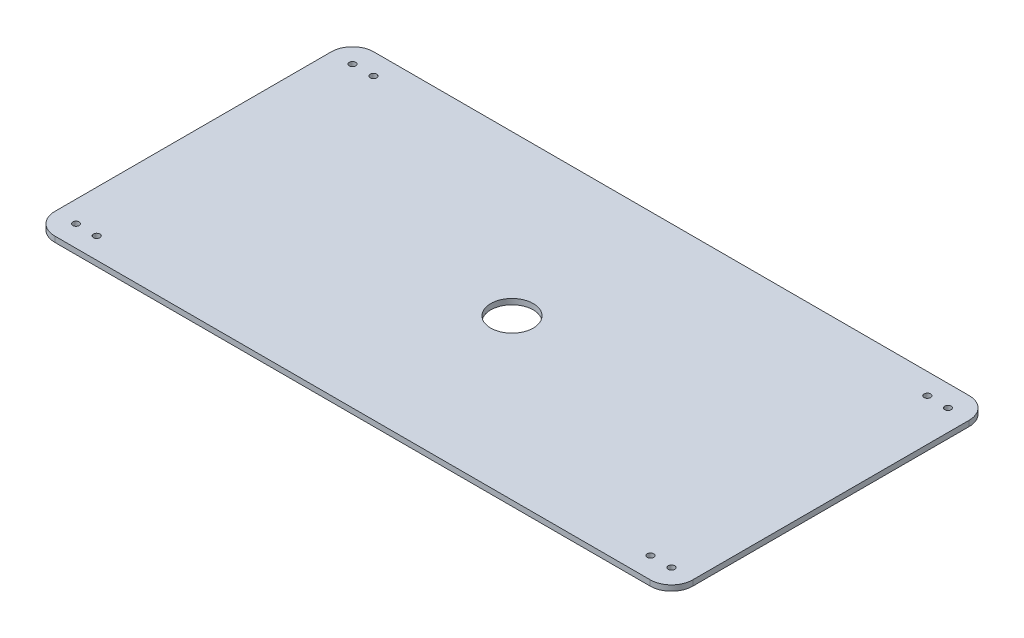
ISO-10303-21;
HEADER;
FILE_DESCRIPTION(('STEP AP214'),'2;1');
FILE_NAME('part.step','',(''),(''),'','','');
FILE_SCHEMA(('AUTOMOTIVE_DESIGN { 1 0 10303 214 1 1 1 1 }'));
ENDSEC;
DATA;
#1=APPLICATION_CONTEXT('core data for automotive mechanical design processes');
#2=APPLICATION_PROTOCOL_DEFINITION('international standard','automotive_design',2000,#1);
#3=PRODUCT_CONTEXT('',#1,'mechanical');
#4=PRODUCT('Part','Part','',(#3));
#5=PRODUCT_RELATED_PRODUCT_CATEGORY('part','',(#4));
#6=PRODUCT_DEFINITION_FORMATION('','',#4);
#7=PRODUCT_DEFINITION_CONTEXT('part definition',#1,'design');
#8=PRODUCT_DEFINITION('design','',#6,#7);
#9=PRODUCT_DEFINITION_SHAPE('','',#8);
#10=(LENGTH_UNIT() NAMED_UNIT(*) SI_UNIT(.MILLI.,.METRE.));
#11=(NAMED_UNIT(*) PLANE_ANGLE_UNIT() SI_UNIT($,.RADIAN.));
#12=(NAMED_UNIT(*) SI_UNIT($,.STERADIAN.) SOLID_ANGLE_UNIT());
#13=UNCERTAINTY_MEASURE_WITH_UNIT(LENGTH_MEASURE(1.E-05),#10,'distance_accuracy_value','');
#14=(GEOMETRIC_REPRESENTATION_CONTEXT(3) GLOBAL_UNCERTAINTY_ASSIGNED_CONTEXT((#13)) GLOBAL_UNIT_ASSIGNED_CONTEXT((#10,
#11,#12)) REPRESENTATION_CONTEXT('',''));
#15=CARTESIAN_POINT('',(0.,0.,0.));
#16=DIRECTION('',(0.,0.,1.));
#17=DIRECTION('',(1.,0.,0.));
#18=AXIS2_PLACEMENT_3D('',#15,#16,#17);
#19=CARTESIAN_POINT('',(0.,2.6,0.));
#20=DIRECTION('',(1.,0.,0.));
#21=DIRECTION('',(0.,0.,-1.));
#22=AXIS2_PLACEMENT_3D('',#19,#20,#21);
#23=PLANE('',#22);
#24=DIRECTION('',(0.,0.,1.));
#25=VECTOR('',#24,1.);
#26=CARTESIAN_POINT('',(0.,2.6,0.));
#27=LINE('',#26,#25);
#28=CARTESIAN_POINT('',(0.,2.6,10.));
#29=VERTEX_POINT('',#28);
#30=CARTESIAN_POINT('',(0.,2.6,140.));
#31=VERTEX_POINT('',#30);
#32=EDGE_CURVE('E120',#29,#31,#27,.T.);
#33=ORIENTED_EDGE('',*,*,#32,.F.);
#34=DIRECTION('',(0.,-1.,0.));
#35=VECTOR('',#34,1.);
#36=CARTESIAN_POINT('',(0.,0.,10.));
#37=LINE('',#36,#35);
#38=CARTESIAN_POINT('',(0.,0.,10.));
#39=VERTEX_POINT('',#38);
#40=EDGE_CURVE('E105',#29,#39,#37,.T.);
#41=ORIENTED_EDGE('',*,*,#40,.T.);
#42=DIRECTION('',(0.,0.,1.));
#43=VECTOR('',#42,1.);
#44=CARTESIAN_POINT('',(0.,0.,0.));
#45=LINE('',#44,#43);
#46=CARTESIAN_POINT('',(0.,0.,140.));
#47=VERTEX_POINT('',#46);
#48=EDGE_CURVE('E117',#39,#47,#45,.T.);
#49=ORIENTED_EDGE('',*,*,#48,.T.);
#50=DIRECTION('',(0.,-1.,0.));
#51=VECTOR('',#50,1.);
#52=CARTESIAN_POINT('',(0.,2.6,140.));
#53=LINE('',#52,#51);
#54=EDGE_CURVE('E122',#47,#31,#53,.F.);
#55=ORIENTED_EDGE('',*,*,#54,.T.);
#56=EDGE_LOOP('',(#33,#41,#49,#55));
#57=FACE_BOUND('',#56,.T.);
#58=ADVANCED_FACE('F35',(#57),#23,.F.);
#59=CARTESIAN_POINT('',(0.,2.6,150.));
#60=DIRECTION('',(0.,0.,-1.));
#61=DIRECTION('',(-1.,0.,0.));
#62=AXIS2_PLACEMENT_3D('',#59,#60,#61);
#63=PLANE('',#62);
#64=DIRECTION('',(1.,0.,0.));
#65=VECTOR('',#64,1.);
#66=CARTESIAN_POINT('',(0.,2.6,150.));
#67=LINE('',#66,#65);
#68=CARTESIAN_POINT('',(10.,2.6,150.));
#69=VERTEX_POINT('',#68);
#70=CARTESIAN_POINT('',(290.,2.6,150.));
#71=VERTEX_POINT('',#70);
#72=EDGE_CURVE('E167',#69,#71,#67,.T.);
#73=ORIENTED_EDGE('',*,*,#72,.F.);
#74=DIRECTION('',(0.,-1.,0.));
#75=VECTOR('',#74,1.);
#76=CARTESIAN_POINT('',(10.,2.6,150.));
#77=LINE('',#76,#75);
#78=CARTESIAN_POINT('',(10.,0.,150.));
#79=VERTEX_POINT('',#78);
#80=EDGE_CURVE('E160',#69,#79,#77,.T.);
#81=ORIENTED_EDGE('',*,*,#80,.T.);
#82=DIRECTION('',(1.,0.,0.));
#83=VECTOR('',#82,1.);
#84=CARTESIAN_POINT('',(0.,0.,150.));
#85=LINE('',#84,#83);
#86=CARTESIAN_POINT('',(290.,0.,150.));
#87=VERTEX_POINT('',#86);
#88=EDGE_CURVE('E126',#79,#87,#85,.T.);
#89=ORIENTED_EDGE('',*,*,#88,.T.);
#90=DIRECTION('',(0.,-1.,0.));
#91=VECTOR('',#90,1.);
#92=CARTESIAN_POINT('',(290.,2.6,150.));
#93=LINE('',#92,#91);
#94=EDGE_CURVE('E158',#87,#71,#93,.F.);
#95=ORIENTED_EDGE('',*,*,#94,.T.);
#96=EDGE_LOOP('',(#73,#81,#89,#95));
#97=FACE_BOUND('',#96,.T.);
#98=ADVANCED_FACE('F165',(#97),#63,.F.);
#99=CARTESIAN_POINT('',(300.,2.6,0.));
#100=DIRECTION('',(1.,0.,0.));
#101=DIRECTION('',(0.,0.,-1.));
#102=AXIS2_PLACEMENT_3D('',#99,#100,#101);
#103=PLANE('',#102);
#104=DIRECTION('',(0.,0.,1.));
#105=VECTOR('',#104,1.);
#106=CARTESIAN_POINT('',(300.,2.6,0.));
#107=LINE('',#106,#105);
#108=CARTESIAN_POINT('',(300.,2.6,10.));
#109=VERTEX_POINT('',#108);
#110=CARTESIAN_POINT('',(300.,2.6,140.));
#111=VERTEX_POINT('',#110);
#112=EDGE_CURVE('E174',#109,#111,#107,.T.);
#113=ORIENTED_EDGE('',*,*,#112,.T.);
#114=DIRECTION('',(0.,-1.,0.));
#115=VECTOR('',#114,1.);
#116=CARTESIAN_POINT('',(300.,0.,140.));
#117=LINE('',#116,#115);
#118=CARTESIAN_POINT('',(300.,0.,140.));
#119=VERTEX_POINT('',#118);
#120=EDGE_CURVE('E11',#111,#119,#117,.T.);
#121=ORIENTED_EDGE('',*,*,#120,.T.);
#122=DIRECTION('',(0.,0.,1.));
#123=VECTOR('',#122,1.);
#124=CARTESIAN_POINT('',(300.,0.,0.));
#125=LINE('',#124,#123);
#126=CARTESIAN_POINT('',(300.,0.,10.));
#127=VERTEX_POINT('',#126);
#128=EDGE_CURVE('E130',#127,#119,#125,.T.);
#129=ORIENTED_EDGE('',*,*,#128,.F.);
#130=DIRECTION('',(0.,-1.,0.));
#131=VECTOR('',#130,1.);
#132=CARTESIAN_POINT('',(300.,2.6,10.));
#133=LINE('',#132,#131);
#134=EDGE_CURVE('E43',#127,#109,#133,.F.);
#135=ORIENTED_EDGE('',*,*,#134,.T.);
#136=EDGE_LOOP('',(#113,#121,#129,#135));
#137=FACE_BOUND('',#136,.T.);
#138=ADVANCED_FACE('F173',(#137),#103,.T.);
#139=CARTESIAN_POINT('',(0.,2.6,0.));
#140=DIRECTION('',(0.,0.,-1.));
#141=DIRECTION('',(-1.,0.,0.));
#142=AXIS2_PLACEMENT_3D('',#139,#140,#141);
#143=PLANE('',#142);
#144=DIRECTION('',(1.,0.,0.));
#145=VECTOR('',#144,1.);
#146=CARTESIAN_POINT('',(0.,0.,0.));
#147=LINE('',#146,#145);
#148=CARTESIAN_POINT('',(10.,0.,0.));
#149=VERTEX_POINT('',#148);
#150=CARTESIAN_POINT('',(290.,0.,0.));
#151=VERTEX_POINT('',#150);
#152=EDGE_CURVE('E141',#149,#151,#147,.T.);
#153=ORIENTED_EDGE('',*,*,#152,.F.);
#154=DIRECTION('',(0.,-1.,0.));
#155=VECTOR('',#154,1.);
#156=CARTESIAN_POINT('',(10.,2.6,0.));
#157=LINE('',#156,#155);
#158=CARTESIAN_POINT('',(10.,2.6,0.));
#159=VERTEX_POINT('',#158);
#160=EDGE_CURVE('E106',#149,#159,#157,.F.);
#161=ORIENTED_EDGE('',*,*,#160,.T.);
#162=DIRECTION('',(1.,0.,0.));
#163=VECTOR('',#162,1.);
#164=CARTESIAN_POINT('',(0.,2.6,0.));
#165=LINE('',#164,#163);
#166=CARTESIAN_POINT('',(290.,2.6,0.));
#167=VERTEX_POINT('',#166);
#168=EDGE_CURVE('E136',#159,#167,#165,.T.);
#169=ORIENTED_EDGE('',*,*,#168,.T.);
#170=DIRECTION('',(0.,-1.,0.));
#171=VECTOR('',#170,1.);
#172=CARTESIAN_POINT('',(290.,2.6,0.));
#173=LINE('',#172,#171);
#174=EDGE_CURVE('E111',#167,#151,#173,.T.);
#175=ORIENTED_EDGE('',*,*,#174,.T.);
#176=EDGE_LOOP('',(#153,#161,#169,#175));
#177=FACE_BOUND('',#176,.T.);
#178=ADVANCED_FACE('F361',(#177),#143,.T.);
#179=CARTESIAN_POINT('',(0.,2.6,0.));
#180=DIRECTION('',(0.,1.,0.));
#181=DIRECTION('',(0.,0.,1.));
#182=AXIS2_PLACEMENT_3D('',#179,#180,#181);
#183=PLANE('',#182);
#184=CARTESIAN_POINT('',(19.812,2.6,140.094));
#185=DIRECTION('',(0.,-1.,0.));
#186=DIRECTION('',(0.,0.,-1.));
#187=AXIS2_PLACEMENT_3D('',#184,#185,#186);
#188=CIRCLE('',#187,1.524);
#189=CARTESIAN_POINT('',(19.812,2.6,138.57));
#190=VERTEX_POINT('',#189);
#191=EDGE_CURVE('E225',#190,#190,#188,.T.);
#192=ORIENTED_EDGE('',*,*,#191,.T.);
#193=EDGE_LOOP('',(#192));
#194=FACE_BOUND('',#193,.T.);
#195=CARTESIAN_POINT('',(280.188,2.6,140.094));
#196=DIRECTION('',(0.,1.,0.));
#197=DIRECTION('',(0.,0.,-1.));
#198=AXIS2_PLACEMENT_3D('',#195,#196,#197);
#199=CIRCLE('',#198,1.524);
#200=CARTESIAN_POINT('',(280.188,2.6,138.57));
#201=VERTEX_POINT('',#200);
#202=EDGE_CURVE('E219',#201,#201,#199,.T.);
#203=ORIENTED_EDGE('',*,*,#202,.F.);
#204=EDGE_LOOP('',(#203));
#205=FACE_BOUND('',#204,.T.);
#206=CARTESIAN_POINT('',(280.188,2.6,9.90599999999998));
#207=DIRECTION('',(0.,-1.,0.));
#208=DIRECTION('',(0.,0.,1.));
#209=AXIS2_PLACEMENT_3D('',#206,#207,#208);
#210=CIRCLE('',#209,1.524);
#211=CARTESIAN_POINT('',(280.188,2.6,11.43));
#212=VERTEX_POINT('',#211);
#213=EDGE_CURVE('E213',#212,#212,#210,.T.);
#214=ORIENTED_EDGE('',*,*,#213,.T.);
#215=EDGE_LOOP('',(#214));
#216=FACE_BOUND('',#215,.T.);
#217=CARTESIAN_POINT('',(19.812,2.6,9.906));
#218=DIRECTION('',(0.,1.,0.));
#219=DIRECTION('',(0.,0.,1.));
#220=AXIS2_PLACEMENT_3D('',#217,#218,#219);
#221=CIRCLE('',#220,1.524);
#222=CARTESIAN_POINT('',(19.812,2.6,11.43));
#223=VERTEX_POINT('',#222);
#224=EDGE_CURVE('E207',#223,#223,#221,.T.);
#225=ORIENTED_EDGE('',*,*,#224,.F.);
#226=EDGE_LOOP('',(#225));
#227=FACE_BOUND('',#226,.T.);
#228=CARTESIAN_POINT('',(150.,2.6,75.));
#229=DIRECTION('',(0.,-1.,0.));
#230=DIRECTION('',(0.,0.,-1.));
#231=AXIS2_PLACEMENT_3D('',#228,#229,#230);
#232=CIRCLE('',#231,9.99999999999998);
#233=CARTESIAN_POINT('',(150.,2.6,65.));
#234=VERTEX_POINT('',#233);
#235=EDGE_CURVE('E198',#234,#234,#232,.T.);
#236=ORIENTED_EDGE('',*,*,#235,.T.);
#237=EDGE_LOOP('',(#236));
#238=FACE_BOUND('',#237,.T.);
#239=CARTESIAN_POINT('',(290.,2.6,140.));
#240=DIRECTION('',(0.,1.,0.));
#241=DIRECTION('',(0.,0.,1.));
#242=AXIS2_PLACEMENT_3D('',#239,#240,#241);
#243=CIRCLE('',#242,1.50000000000002);
#244=CARTESIAN_POINT('',(290.,2.6,141.5));
#245=VERTEX_POINT('',#244);
#246=EDGE_CURVE('E192',#245,#245,#243,.T.);
#247=ORIENTED_EDGE('',*,*,#246,.F.);
#248=EDGE_LOOP('',(#247));
#249=FACE_BOUND('',#248,.T.);
#250=CARTESIAN_POINT('',(10.,2.6,140.));
#251=DIRECTION('',(0.,-1.,0.));
#252=DIRECTION('',(0.,0.,1.));
#253=AXIS2_PLACEMENT_3D('',#250,#251,#252);
#254=CIRCLE('',#253,1.50000000000002);
#255=CARTESIAN_POINT('',(10.,2.6,141.5));
#256=VERTEX_POINT('',#255);
#257=EDGE_CURVE('E186',#256,#256,#254,.T.);
#258=ORIENTED_EDGE('',*,*,#257,.T.);
#259=EDGE_LOOP('',(#258));
#260=FACE_BOUND('',#259,.T.);
#261=CARTESIAN_POINT('',(10.,2.6,10.));
#262=DIRECTION('',(0.,1.,0.));
#263=DIRECTION('',(0.,0.,-1.));
#264=AXIS2_PLACEMENT_3D('',#261,#262,#263);
#265=CIRCLE('',#264,1.50000000000002);
#266=CARTESIAN_POINT('',(10.,2.6,8.49999999999999));
#267=VERTEX_POINT('',#266);
#268=EDGE_CURVE('E181',#267,#267,#265,.T.);
#269=ORIENTED_EDGE('',*,*,#268,.F.);
#270=EDGE_LOOP('',(#269));
#271=FACE_BOUND('',#270,.T.);
#272=CARTESIAN_POINT('',(290.,2.6,10.));
#273=DIRECTION('',(0.,-1.,0.));
#274=DIRECTION('',(0.,0.,-1.));
#275=AXIS2_PLACEMENT_3D('',#272,#273,#274);
#276=CIRCLE('',#275,1.50000000000002);
#277=CARTESIAN_POINT('',(290.,2.6,8.49999999999998));
#278=VERTEX_POINT('',#277);
#279=EDGE_CURVE('E127',#278,#278,#276,.T.);
#280=ORIENTED_EDGE('',*,*,#279,.T.);
#281=EDGE_LOOP('',(#280));
#282=FACE_BOUND('',#281,.T.);
#283=ORIENTED_EDGE('',*,*,#168,.F.);
#284=CARTESIAN_POINT('',(10.,2.6,10.));
#285=DIRECTION('',(0.,1.,0.));
#286=DIRECTION('',(0.,0.,1.));
#287=AXIS2_PLACEMENT_3D('',#284,#285,#286);
#288=CIRCLE('',#287,10.);
#289=EDGE_CURVE('E156',#159,#29,#288,.T.);
#290=ORIENTED_EDGE('',*,*,#289,.T.);
#291=ORIENTED_EDGE('',*,*,#32,.T.);
#292=CARTESIAN_POINT('',(10.,2.6,140.));
#293=DIRECTION('',(0.,1.,0.));
#294=DIRECTION('',(0.,0.,1.));
#295=AXIS2_PLACEMENT_3D('',#292,#293,#294);
#296=CIRCLE('',#295,10.);
#297=EDGE_CURVE('E154',#31,#69,#296,.T.);
#298=ORIENTED_EDGE('',*,*,#297,.T.);
#299=ORIENTED_EDGE('',*,*,#72,.T.);
#300=CARTESIAN_POINT('',(290.,2.6,140.));
#301=DIRECTION('',(0.,1.,0.));
#302=DIRECTION('',(0.,0.,1.));
#303=AXIS2_PLACEMENT_3D('',#300,#301,#302);
#304=CIRCLE('',#303,10.);
#305=EDGE_CURVE('E50',#71,#111,#304,.T.);
#306=ORIENTED_EDGE('',*,*,#305,.T.);
#307=ORIENTED_EDGE('',*,*,#112,.F.);
#308=CARTESIAN_POINT('',(290.,2.6,10.));
#309=DIRECTION('',(0.,1.,0.));
#310=DIRECTION('',(0.,0.,1.));
#311=AXIS2_PLACEMENT_3D('',#308,#309,#310);
#312=CIRCLE('',#311,10.);
#313=EDGE_CURVE('E151',#109,#167,#312,.T.);
#314=ORIENTED_EDGE('',*,*,#313,.T.);
#315=EDGE_LOOP('',(#283,#290,#291,#298,#299,#306,#307,#314));
#316=FACE_BOUND('',#315,.T.);
#317=ADVANCED_FACE('F236',(#194,#205,#216,#227,#238,#249,#260,#271,#282,#316),#183,.T.);
#318=CARTESIAN_POINT('',(0.,0.,0.));
#319=DIRECTION('',(0.,1.,0.));
#320=DIRECTION('',(0.,0.,1.));
#321=AXIS2_PLACEMENT_3D('',#318,#319,#320);
#322=PLANE('',#321);
#323=CARTESIAN_POINT('',(19.812,1.19999999954185E-07,140.094));
#324=DIRECTION('',(0.,-1.,0.));
#325=DIRECTION('',(0.,0.,-1.));
#326=AXIS2_PLACEMENT_3D('',#323,#324,#325);
#327=CIRCLE('',#326,1.524);
#328=CARTESIAN_POINT('',(19.812,1.19999999954185E-07,138.57));
#329=VERTEX_POINT('',#328);
#330=EDGE_CURVE('E222',#329,#329,#327,.T.);
#331=ORIENTED_EDGE('',*,*,#330,.F.);
#332=EDGE_LOOP('',(#331));
#333=FACE_BOUND('',#332,.T.);
#334=CARTESIAN_POINT('',(280.188,1.19999999954185E-07,140.094));
#335=DIRECTION('',(0.,1.,0.));
#336=DIRECTION('',(0.,0.,-1.));
#337=AXIS2_PLACEMENT_3D('',#334,#335,#336);
#338=CIRCLE('',#337,1.524);
#339=CARTESIAN_POINT('',(280.188,1.19999999954185E-07,138.57));
#340=VERTEX_POINT('',#339);
#341=EDGE_CURVE('E216',#340,#340,#338,.T.);
#342=ORIENTED_EDGE('',*,*,#341,.T.);
#343=EDGE_LOOP('',(#342));
#344=FACE_BOUND('',#343,.T.);
#345=CARTESIAN_POINT('',(280.188,1.19999999954185E-07,9.90599999999998));
#346=DIRECTION('',(0.,-1.,0.));
#347=DIRECTION('',(0.,0.,1.));
#348=AXIS2_PLACEMENT_3D('',#345,#346,#347);
#349=CIRCLE('',#348,1.524);
#350=CARTESIAN_POINT('',(280.188,1.19999999954185E-07,11.43));
#351=VERTEX_POINT('',#350);
#352=EDGE_CURVE('E210',#351,#351,#349,.T.);
#353=ORIENTED_EDGE('',*,*,#352,.F.);
#354=EDGE_LOOP('',(#353));
#355=FACE_BOUND('',#354,.T.);
#356=CARTESIAN_POINT('',(19.812,1.19999999954185E-07,9.906));
#357=DIRECTION('',(0.,1.,0.));
#358=DIRECTION('',(0.,0.,1.));
#359=AXIS2_PLACEMENT_3D('',#356,#357,#358);
#360=CIRCLE('',#359,1.524);
#361=CARTESIAN_POINT('',(19.812,1.19999999954185E-07,11.43));
#362=VERTEX_POINT('',#361);
#363=EDGE_CURVE('E204',#362,#362,#360,.T.);
#364=ORIENTED_EDGE('',*,*,#363,.T.);
#365=EDGE_LOOP('',(#364));
#366=FACE_BOUND('',#365,.T.);
#367=CARTESIAN_POINT('',(150.,0.,75.));
#368=DIRECTION('',(0.,-1.,0.));
#369=DIRECTION('',(0.,0.,-1.));
#370=AXIS2_PLACEMENT_3D('',#367,#368,#369);
#371=CIRCLE('',#370,9.99999999999998);
#372=CARTESIAN_POINT('',(150.,0.,65.));
#373=VERTEX_POINT('',#372);
#374=EDGE_CURVE('E201',#373,#373,#371,.T.);
#375=ORIENTED_EDGE('',*,*,#374,.F.);
#376=EDGE_LOOP('',(#375));
#377=FACE_BOUND('',#376,.T.);
#378=CARTESIAN_POINT('',(290.,0.,140.));
#379=DIRECTION('',(0.,1.,0.));
#380=DIRECTION('',(0.,0.,1.));
#381=AXIS2_PLACEMENT_3D('',#378,#379,#380);
#382=CIRCLE('',#381,1.50000000000002);
#383=CARTESIAN_POINT('',(290.,0.,141.5));
#384=VERTEX_POINT('',#383);
#385=EDGE_CURVE('E195',#384,#384,#382,.T.);
#386=ORIENTED_EDGE('',*,*,#385,.T.);
#387=EDGE_LOOP('',(#386));
#388=FACE_BOUND('',#387,.T.);
#389=CARTESIAN_POINT('',(10.,0.,140.));
#390=DIRECTION('',(0.,-1.,0.));
#391=DIRECTION('',(0.,0.,1.));
#392=AXIS2_PLACEMENT_3D('',#389,#390,#391);
#393=CIRCLE('',#392,1.50000000000002);
#394=CARTESIAN_POINT('',(10.,0.,141.5));
#395=VERTEX_POINT('',#394);
#396=EDGE_CURVE('E189',#395,#395,#393,.T.);
#397=ORIENTED_EDGE('',*,*,#396,.F.);
#398=EDGE_LOOP('',(#397));
#399=FACE_BOUND('',#398,.T.);
#400=CARTESIAN_POINT('',(10.,0.,10.));
#401=DIRECTION('',(0.,1.,0.));
#402=DIRECTION('',(0.,0.,-1.));
#403=AXIS2_PLACEMENT_3D('',#400,#401,#402);
#404=CIRCLE('',#403,1.50000000000002);
#405=CARTESIAN_POINT('',(10.,0.,8.49999999999999));
#406=VERTEX_POINT('',#405);
#407=EDGE_CURVE('E183',#406,#406,#404,.T.);
#408=ORIENTED_EDGE('',*,*,#407,.T.);
#409=EDGE_LOOP('',(#408));
#410=FACE_BOUND('',#409,.T.);
#411=CARTESIAN_POINT('',(290.,0.,10.));
#412=DIRECTION('',(0.,-1.,0.));
#413=DIRECTION('',(0.,0.,-1.));
#414=AXIS2_PLACEMENT_3D('',#411,#412,#413);
#415=CIRCLE('',#414,1.50000000000002);
#416=CARTESIAN_POINT('',(290.,0.,8.49999999999998));
#417=VERTEX_POINT('',#416);
#418=EDGE_CURVE('E133',#417,#417,#415,.T.);
#419=ORIENTED_EDGE('',*,*,#418,.F.);
#420=EDGE_LOOP('',(#419));
#421=FACE_BOUND('',#420,.T.);
#422=ORIENTED_EDGE('',*,*,#48,.F.);
#423=CARTESIAN_POINT('',(10.,0.,10.));
#424=DIRECTION('',(0.,1.,0.));
#425=DIRECTION('',(0.,0.,1.));
#426=AXIS2_PLACEMENT_3D('',#423,#424,#425);
#427=CIRCLE('',#426,10.);
#428=EDGE_CURVE('E101',#39,#149,#427,.F.);
#429=ORIENTED_EDGE('',*,*,#428,.T.);
#430=ORIENTED_EDGE('',*,*,#152,.T.);
#431=CARTESIAN_POINT('',(290.,0.,10.));
#432=DIRECTION('',(0.,1.,0.));
#433=DIRECTION('',(0.,0.,1.));
#434=AXIS2_PLACEMENT_3D('',#431,#432,#433);
#435=CIRCLE('',#434,10.);
#436=EDGE_CURVE('E121',#151,#127,#435,.F.);
#437=ORIENTED_EDGE('',*,*,#436,.T.);
#438=ORIENTED_EDGE('',*,*,#128,.T.);
#439=CARTESIAN_POINT('',(290.,0.,140.));
#440=DIRECTION('',(0.,1.,0.));
#441=DIRECTION('',(0.,0.,1.));
#442=AXIS2_PLACEMENT_3D('',#439,#440,#441);
#443=CIRCLE('',#442,10.);
#444=EDGE_CURVE('E145',#119,#87,#443,.F.);
#445=ORIENTED_EDGE('',*,*,#444,.T.);
#446=ORIENTED_EDGE('',*,*,#88,.F.);
#447=CARTESIAN_POINT('',(10.,0.,140.));
#448=DIRECTION('',(0.,1.,0.));
#449=DIRECTION('',(0.,0.,1.));
#450=AXIS2_PLACEMENT_3D('',#447,#448,#449);
#451=CIRCLE('',#450,10.);
#452=EDGE_CURVE('E112',#79,#47,#451,.F.);
#453=ORIENTED_EDGE('',*,*,#452,.T.);
#454=EDGE_LOOP('',(#422,#429,#430,#437,#438,#445,#446,#453));
#455=FACE_BOUND('',#454,.T.);
#456=ADVANCED_FACE('F124',(#333,#344,#355,#366,#377,#388,#399,#410,#421,#455),#322,.F.);
#457=CARTESIAN_POINT('',(10.,2.6,10.));
#458=DIRECTION('',(0.,1.,0.));
#459=DIRECTION('',(0.,0.,1.));
#460=AXIS2_PLACEMENT_3D('',#457,#458,#459);
#461=CYLINDRICAL_SURFACE('',#460,10.);
#462=ORIENTED_EDGE('',*,*,#289,.F.);
#463=ORIENTED_EDGE('',*,*,#160,.F.);
#464=ORIENTED_EDGE('',*,*,#428,.F.);
#465=ORIENTED_EDGE('',*,*,#40,.F.);
#466=EDGE_LOOP('',(#462,#463,#464,#465));
#467=FACE_BOUND('',#466,.T.);
#468=ADVANCED_FACE('F104',(#467),#461,.T.);
#469=CARTESIAN_POINT('',(10.,2.6,140.));
#470=DIRECTION('',(0.,-1.,0.));
#471=DIRECTION('',(0.,0.,-1.));
#472=AXIS2_PLACEMENT_3D('',#469,#470,#471);
#473=CYLINDRICAL_SURFACE('',#472,10.);
#474=ORIENTED_EDGE('',*,*,#297,.F.);
#475=ORIENTED_EDGE('',*,*,#54,.F.);
#476=ORIENTED_EDGE('',*,*,#452,.F.);
#477=ORIENTED_EDGE('',*,*,#80,.F.);
#478=EDGE_LOOP('',(#474,#475,#476,#477));
#479=FACE_BOUND('',#478,.T.);
#480=ADVANCED_FACE('F279',(#479),#473,.T.);
#481=CARTESIAN_POINT('',(290.,2.6,140.));
#482=DIRECTION('',(0.,1.,0.));
#483=DIRECTION('',(0.,0.,1.));
#484=AXIS2_PLACEMENT_3D('',#481,#482,#483);
#485=CYLINDRICAL_SURFACE('',#484,10.);
#486=ORIENTED_EDGE('',*,*,#305,.F.);
#487=ORIENTED_EDGE('',*,*,#94,.F.);
#488=ORIENTED_EDGE('',*,*,#444,.F.);
#489=ORIENTED_EDGE('',*,*,#120,.F.);
#490=EDGE_LOOP('',(#486,#487,#488,#489));
#491=FACE_BOUND('',#490,.T.);
#492=ADVANCED_FACE('F172',(#491),#485,.T.);
#493=CARTESIAN_POINT('',(290.,2.6,10.));
#494=DIRECTION('',(0.,-1.,0.));
#495=DIRECTION('',(0.,0.,-1.));
#496=AXIS2_PLACEMENT_3D('',#493,#494,#495);
#497=CYLINDRICAL_SURFACE('',#496,10.);
#498=ORIENTED_EDGE('',*,*,#313,.F.);
#499=ORIENTED_EDGE('',*,*,#134,.F.);
#500=ORIENTED_EDGE('',*,*,#436,.F.);
#501=ORIENTED_EDGE('',*,*,#174,.F.);
#502=EDGE_LOOP('',(#498,#499,#500,#501));
#503=FACE_BOUND('',#502,.T.);
#504=ADVANCED_FACE('F37',(#503),#497,.T.);
#505=CARTESIAN_POINT('',(290.,2.6,10.));
#506=DIRECTION('',(0.,-1.,0.));
#507=DIRECTION('',(0.,0.,-1.));
#508=AXIS2_PLACEMENT_3D('',#505,#506,#507);
#509=CYLINDRICAL_SURFACE('',#508,1.50000000000002);
#510=ORIENTED_EDGE('',*,*,#279,.F.);
#511=EDGE_LOOP('',(#510));
#512=FACE_BOUND('',#511,.T.);
#513=ORIENTED_EDGE('',*,*,#418,.T.);
#514=EDGE_LOOP('',(#513));
#515=FACE_BOUND('',#514,.T.);
#516=ADVANCED_FACE('F254',(#512,#515),#509,.F.);
#517=CARTESIAN_POINT('',(10.,2.6,10.));
#518=DIRECTION('',(0.,-1.,0.));
#519=DIRECTION('',(0.,0.,-1.));
#520=AXIS2_PLACEMENT_3D('',#517,#518,#519);
#521=CYLINDRICAL_SURFACE('',#520,1.50000000000002);
#522=ORIENTED_EDGE('',*,*,#268,.T.);
#523=EDGE_LOOP('',(#522));
#524=FACE_BOUND('',#523,.T.);
#525=ORIENTED_EDGE('',*,*,#407,.F.);
#526=EDGE_LOOP('',(#525));
#527=FACE_BOUND('',#526,.T.);
#528=ADVANCED_FACE('F256',(#524,#527),#521,.F.);
#529=CARTESIAN_POINT('',(10.,2.6,140.));
#530=DIRECTION('',(0.,-1.,0.));
#531=DIRECTION('',(0.,0.,-1.));
#532=AXIS2_PLACEMENT_3D('',#529,#530,#531);
#533=CYLINDRICAL_SURFACE('',#532,1.50000000000002);
#534=ORIENTED_EDGE('',*,*,#257,.F.);
#535=EDGE_LOOP('',(#534));
#536=FACE_BOUND('',#535,.T.);
#537=ORIENTED_EDGE('',*,*,#396,.T.);
#538=EDGE_LOOP('',(#537));
#539=FACE_BOUND('',#538,.T.);
#540=ADVANCED_FACE('F263',(#536,#539),#533,.F.);
#541=CARTESIAN_POINT('',(290.,2.6,140.));
#542=DIRECTION('',(0.,-1.,0.));
#543=DIRECTION('',(0.,0.,-1.));
#544=AXIS2_PLACEMENT_3D('',#541,#542,#543);
#545=CYLINDRICAL_SURFACE('',#544,1.50000000000002);
#546=ORIENTED_EDGE('',*,*,#246,.T.);
#547=EDGE_LOOP('',(#546));
#548=FACE_BOUND('',#547,.T.);
#549=ORIENTED_EDGE('',*,*,#385,.F.);
#550=EDGE_LOOP('',(#549));
#551=FACE_BOUND('',#550,.T.);
#552=ADVANCED_FACE('F309',(#548,#551),#545,.F.);
#553=CARTESIAN_POINT('',(150.,2.6,75.));
#554=DIRECTION('',(0.,-1.,0.));
#555=DIRECTION('',(0.,0.,-1.));
#556=AXIS2_PLACEMENT_3D('',#553,#554,#555);
#557=CYLINDRICAL_SURFACE('',#556,9.99999999999998);
#558=ORIENTED_EDGE('',*,*,#235,.F.);
#559=EDGE_LOOP('',(#558));
#560=FACE_BOUND('',#559,.T.);
#561=ORIENTED_EDGE('',*,*,#374,.T.);
#562=EDGE_LOOP('',(#561));
#563=FACE_BOUND('',#562,.T.);
#564=ADVANCED_FACE('F319',(#560,#563),#557,.F.);
#565=CARTESIAN_POINT('',(19.812,1.19999999954185E-07,9.906));
#566=DIRECTION('',(0.,1.,0.));
#567=DIRECTION('',(0.,0.,1.));
#568=AXIS2_PLACEMENT_3D('',#565,#566,#567);
#569=CYLINDRICAL_SURFACE('',#568,1.524);
#570=ORIENTED_EDGE('',*,*,#363,.F.);
#571=EDGE_LOOP('',(#570));
#572=FACE_BOUND('',#571,.T.);
#573=ORIENTED_EDGE('',*,*,#224,.T.);
#574=EDGE_LOOP('',(#573));
#575=FACE_BOUND('',#574,.T.);
#576=ADVANCED_FACE('F329',(#572,#575),#569,.F.);
#577=CARTESIAN_POINT('',(280.188,1.19999999954185E-07,9.90599999999998));
#578=DIRECTION('',(0.,1.,0.));
#579=DIRECTION('',(0.,0.,1.));
#580=AXIS2_PLACEMENT_3D('',#577,#578,#579);
#581=CYLINDRICAL_SURFACE('',#580,1.524);
#582=ORIENTED_EDGE('',*,*,#352,.T.);
#583=EDGE_LOOP('',(#582));
#584=FACE_BOUND('',#583,.T.);
#585=ORIENTED_EDGE('',*,*,#213,.F.);
#586=EDGE_LOOP('',(#585));
#587=FACE_BOUND('',#586,.T.);
#588=ADVANCED_FACE('F339',(#584,#587),#581,.F.);
#589=CARTESIAN_POINT('',(280.188,1.19999999954185E-07,140.094));
#590=DIRECTION('',(0.,1.,0.));
#591=DIRECTION('',(0.,0.,1.));
#592=AXIS2_PLACEMENT_3D('',#589,#590,#591);
#593=CYLINDRICAL_SURFACE('',#592,1.524);
#594=ORIENTED_EDGE('',*,*,#341,.F.);
#595=EDGE_LOOP('',(#594));
#596=FACE_BOUND('',#595,.T.);
#597=ORIENTED_EDGE('',*,*,#202,.T.);
#598=EDGE_LOOP('',(#597));
#599=FACE_BOUND('',#598,.T.);
#600=ADVANCED_FACE('F349',(#596,#599),#593,.F.);
#601=CARTESIAN_POINT('',(19.812,1.19999999954185E-07,140.094));
#602=DIRECTION('',(0.,1.,0.));
#603=DIRECTION('',(0.,0.,1.));
#604=AXIS2_PLACEMENT_3D('',#601,#602,#603);
#605=CYLINDRICAL_SURFACE('',#604,1.524);
#606=ORIENTED_EDGE('',*,*,#330,.T.);
#607=EDGE_LOOP('',(#606));
#608=FACE_BOUND('',#607,.T.);
#609=ORIENTED_EDGE('',*,*,#191,.F.);
#610=EDGE_LOOP('',(#609));
#611=FACE_BOUND('',#610,.T.);
#612=ADVANCED_FACE('F231',(#608,#611),#605,.F.);
#613=CLOSED_SHELL('',(#58,#98,#138,#178,#317,#456,#468,#480,#492,#504,#516,#528,#540,#552,#564,
#576,#588,#600,#612));
#614=MANIFOLD_SOLID_BREP('B2',#613);
#615=ADVANCED_BREP_SHAPE_REPRESENTATION('',(#18,#614),#14);
#616=SHAPE_DEFINITION_REPRESENTATION(#9,#615);
ENDSEC;
END-ISO-10303-21;
